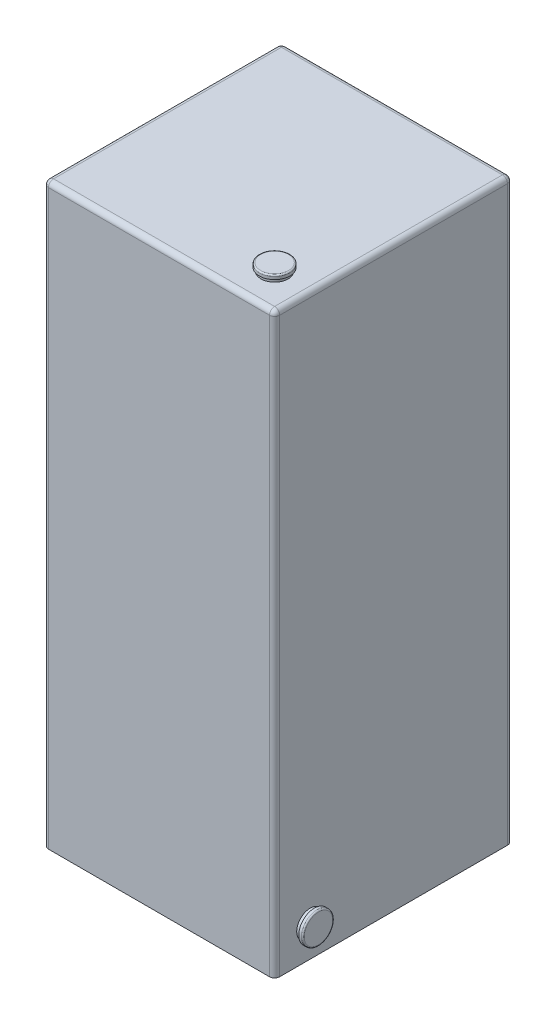
ISO-10303-21;
HEADER;
FILE_DESCRIPTION(('STEP AP214'),'2;1');
FILE_NAME('part.step','',(''),(''),'','','');
FILE_SCHEMA(('AUTOMOTIVE_DESIGN { 1 0 10303 214 1 1 1 1 }'));
ENDSEC;
DATA;
#1=APPLICATION_CONTEXT('core data for automotive mechanical design processes');
#2=APPLICATION_PROTOCOL_DEFINITION('international standard','automotive_design',2000,#1);
#3=PRODUCT_CONTEXT('',#1,'mechanical');
#4=PRODUCT('Part','Part','',(#3));
#5=PRODUCT_RELATED_PRODUCT_CATEGORY('part','',(#4));
#6=PRODUCT_DEFINITION_FORMATION('','',#4);
#7=PRODUCT_DEFINITION_CONTEXT('part definition',#1,'design');
#8=PRODUCT_DEFINITION('design','',#6,#7);
#9=PRODUCT_DEFINITION_SHAPE('','',#8);
#10=(LENGTH_UNIT() NAMED_UNIT(*) SI_UNIT(.MILLI.,.METRE.));
#11=(NAMED_UNIT(*) PLANE_ANGLE_UNIT() SI_UNIT($,.RADIAN.));
#12=(NAMED_UNIT(*) SI_UNIT($,.STERADIAN.) SOLID_ANGLE_UNIT());
#13=UNCERTAINTY_MEASURE_WITH_UNIT(LENGTH_MEASURE(1.E-05),#10,'distance_accuracy_value','');
#14=(GEOMETRIC_REPRESENTATION_CONTEXT(3) GLOBAL_UNCERTAINTY_ASSIGNED_CONTEXT((#13)) GLOBAL_UNIT_ASSIGNED_CONTEXT((#10,
#11,#12)) REPRESENTATION_CONTEXT('',''));
#15=CARTESIAN_POINT('',(0.,0.,0.));
#16=DIRECTION('',(0.,0.,1.));
#17=DIRECTION('',(1.,0.,0.));
#18=AXIS2_PLACEMENT_3D('',#15,#16,#17);
#19=CARTESIAN_POINT('',(704.,90.,595.));
#20=DIRECTION('',(-1.,0.,0.));
#21=DIRECTION('',(0.,0.,1.));
#22=AXIS2_PLACEMENT_3D('',#19,#20,#21);
#23=CYLINDRICAL_SURFACE('',#22,40.);
#24=CARTESIAN_POINT('',(680.,90.,595.));
#25=DIRECTION('',(-1.,0.,0.));
#26=DIRECTION('',(0.,0.,1.));
#27=AXIS2_PLACEMENT_3D('',#24,#25,#26);
#28=CIRCLE('',#27,40.);
#29=CARTESIAN_POINT('',(680.,90.,635.));
#30=VERTEX_POINT('',#29);
#31=EDGE_CURVE('E218',#30,#30,#28,.F.);
#32=ORIENTED_EDGE('',*,*,#31,.T.);
#33=EDGE_LOOP('',(#32));
#34=FACE_BOUND('',#33,.T.);
#35=CARTESIAN_POINT('',(692.,90.,595.));
#36=DIRECTION('',(1.,0.,0.));
#37=DIRECTION('',(0.,0.,-1.));
#38=AXIS2_PLACEMENT_3D('',#35,#36,#37);
#39=CIRCLE('',#38,40.);
#40=CARTESIAN_POINT('',(692.,90.,555.));
#41=VERTEX_POINT('',#40);
#42=EDGE_CURVE('E221',#41,#41,#39,.T.);
#43=ORIENTED_EDGE('',*,*,#42,.F.);
#44=EDGE_LOOP('',(#43));
#45=FACE_BOUND('',#44,.T.);
#46=ADVANCED_FACE('F36',(#34,#45),#23,.T.);
#47=CARTESIAN_POINT('',(575.,1722.,595.));
#48=DIRECTION('',(0.,-1.,0.));
#49=DIRECTION('',(0.,0.,-1.));
#50=AXIS2_PLACEMENT_3D('',#47,#48,#49);
#51=CYLINDRICAL_SURFACE('',#50,40.);
#52=CARTESIAN_POINT('',(575.,1700.,595.));
#53=DIRECTION('',(0.,-1.,0.));
#54=DIRECTION('',(0.,0.,-1.));
#55=AXIS2_PLACEMENT_3D('',#52,#53,#54);
#56=CIRCLE('',#55,40.);
#57=CARTESIAN_POINT('',(575.,1700.,555.));
#58=VERTEX_POINT('',#57);
#59=EDGE_CURVE('E171',#58,#58,#56,.F.);
#60=ORIENTED_EDGE('',*,*,#59,.T.);
#61=EDGE_LOOP('',(#60));
#62=FACE_BOUND('',#61,.T.);
#63=CARTESIAN_POINT('',(575.,1710.,595.));
#64=DIRECTION('',(0.,1.,0.));
#65=DIRECTION('',(0.,0.,1.));
#66=AXIS2_PLACEMENT_3D('',#63,#64,#65);
#67=CIRCLE('',#66,40.);
#68=CARTESIAN_POINT('',(575.,1710.,635.));
#69=VERTEX_POINT('',#68);
#70=EDGE_CURVE('E209',#69,#69,#67,.T.);
#71=ORIENTED_EDGE('',*,*,#70,.F.);
#72=EDGE_LOOP('',(#71));
#73=FACE_BOUND('',#72,.T.);
#74=ADVANCED_FACE('F237',(#62,#73),#51,.T.);
#75=CARTESIAN_POINT('',(0.,0.,700.));
#76=DIRECTION('',(1.,0.,0.));
#77=DIRECTION('',(0.,0.,-1.));
#78=AXIS2_PLACEMENT_3D('',#75,#76,#77);
#79=PLANE('',#78);
#80=DIRECTION('',(0.,0.,-1.));
#81=VECTOR('',#80,1.);
#82=CARTESIAN_POINT('',(0.,1685.,700.));
#83=LINE('',#82,#81);
#84=CARTESIAN_POINT('',(0.,1685.,685.));
#85=VERTEX_POINT('',#84);
#86=CARTESIAN_POINT('',(0.,1685.,15.));
#87=VERTEX_POINT('',#86);
#88=EDGE_CURVE('E131',#85,#87,#83,.T.);
#89=ORIENTED_EDGE('',*,*,#88,.T.);
#90=DIRECTION('',(0.,-1.,0.));
#91=VECTOR('',#90,1.);
#92=CARTESIAN_POINT('',(0.,0.,15.));
#93=LINE('',#92,#91);
#94=CARTESIAN_POINT('',(0.,0.,15.));
#95=VERTEX_POINT('',#94);
#96=EDGE_CURVE('E130',#87,#95,#93,.T.);
#97=ORIENTED_EDGE('',*,*,#96,.T.);
#98=DIRECTION('',(0.,0.,-1.));
#99=VECTOR('',#98,1.);
#100=CARTESIAN_POINT('',(0.,0.,700.));
#101=LINE('',#100,#99);
#102=CARTESIAN_POINT('',(0.,0.,685.));
#103=VERTEX_POINT('',#102);
#104=EDGE_CURVE('E117',#103,#95,#101,.T.);
#105=ORIENTED_EDGE('',*,*,#104,.F.);
#106=DIRECTION('',(0.,-1.,0.));
#107=VECTOR('',#106,1.);
#108=CARTESIAN_POINT('',(0.,0.,685.));
#109=LINE('',#108,#107);
#110=EDGE_CURVE('E127',#103,#85,#109,.F.);
#111=ORIENTED_EDGE('',*,*,#110,.T.);
#112=EDGE_LOOP('',(#89,#97,#105,#111));
#113=FACE_BOUND('',#112,.T.);
#114=ADVANCED_FACE('F126',(#113),#79,.F.);
#115=CARTESIAN_POINT('',(0.,0.,700.));
#116=DIRECTION('',(0.,1.,0.));
#117=DIRECTION('',(0.,0.,1.));
#118=AXIS2_PLACEMENT_3D('',#115,#116,#117);
#119=PLANE('',#118);
#120=ORIENTED_EDGE('',*,*,#104,.T.);
#121=CARTESIAN_POINT('',(15.,0.,15.));
#122=DIRECTION('',(0.,1.,0.));
#123=DIRECTION('',(0.,0.,1.));
#124=AXIS2_PLACEMENT_3D('',#121,#122,#123);
#125=CIRCLE('',#124,15.);
#126=CARTESIAN_POINT('',(15.,0.,0.));
#127=VERTEX_POINT('',#126);
#128=EDGE_CURVE('E144',#95,#127,#125,.F.);
#129=ORIENTED_EDGE('',*,*,#128,.T.);
#130=DIRECTION('',(1.,0.,0.));
#131=VECTOR('',#130,1.);
#132=CARTESIAN_POINT('',(0.,0.,0.));
#133=LINE('',#132,#131);
#134=CARTESIAN_POINT('',(665.,0.,0.));
#135=VERTEX_POINT('',#134);
#136=EDGE_CURVE('E206',#127,#135,#133,.T.);
#137=ORIENTED_EDGE('',*,*,#136,.T.);
#138=CARTESIAN_POINT('',(665.,0.,15.));
#139=DIRECTION('',(0.,1.,0.));
#140=DIRECTION('',(0.,0.,1.));
#141=AXIS2_PLACEMENT_3D('',#138,#139,#140);
#142=CIRCLE('',#141,15.);
#143=CARTESIAN_POINT('',(680.,0.,15.));
#144=VERTEX_POINT('',#143);
#145=EDGE_CURVE('E121',#135,#144,#142,.F.);
#146=ORIENTED_EDGE('',*,*,#145,.T.);
#147=DIRECTION('',(0.,0.,-1.));
#148=VECTOR('',#147,1.);
#149=CARTESIAN_POINT('',(680.,0.,700.));
#150=LINE('',#149,#148);
#151=CARTESIAN_POINT('',(680.,0.,685.));
#152=VERTEX_POINT('',#151);
#153=EDGE_CURVE('E132',#152,#144,#150,.T.);
#154=ORIENTED_EDGE('',*,*,#153,.F.);
#155=CARTESIAN_POINT('',(665.,0.,685.));
#156=DIRECTION('',(0.,1.,0.));
#157=DIRECTION('',(0.,0.,1.));
#158=AXIS2_PLACEMENT_3D('',#155,#156,#157);
#159=CIRCLE('',#158,15.);
#160=CARTESIAN_POINT('',(665.,0.,700.));
#161=VERTEX_POINT('',#160);
#162=EDGE_CURVE('E122',#152,#161,#159,.F.);
#163=ORIENTED_EDGE('',*,*,#162,.T.);
#164=DIRECTION('',(1.,0.,0.));
#165=VECTOR('',#164,1.);
#166=CARTESIAN_POINT('',(0.,0.,700.));
#167=LINE('',#166,#165);
#168=CARTESIAN_POINT('',(15.,0.,700.));
#169=VERTEX_POINT('',#168);
#170=EDGE_CURVE('E118',#169,#161,#167,.T.);
#171=ORIENTED_EDGE('',*,*,#170,.F.);
#172=CARTESIAN_POINT('',(15.,0.,685.));
#173=DIRECTION('',(0.,1.,0.));
#174=DIRECTION('',(0.,0.,1.));
#175=AXIS2_PLACEMENT_3D('',#172,#173,#174);
#176=CIRCLE('',#175,15.);
#177=EDGE_CURVE('E114',#169,#103,#176,.F.);
#178=ORIENTED_EDGE('',*,*,#177,.T.);
#179=EDGE_LOOP('',(#120,#129,#137,#146,#154,#163,#171,#178));
#180=FACE_BOUND('',#179,.T.);
#181=ADVANCED_FACE('F116',(#180),#119,.F.);
#182=CARTESIAN_POINT('',(680.,0.,700.));
#183=DIRECTION('',(-1.,0.,0.));
#184=DIRECTION('',(0.,0.,1.));
#185=AXIS2_PLACEMENT_3D('',#182,#183,#184);
#186=PLANE('',#185);
#187=ORIENTED_EDGE('',*,*,#31,.F.);
#188=EDGE_LOOP('',(#187));
#189=FACE_BOUND('',#188,.T.);
#190=ORIENTED_EDGE('',*,*,#153,.T.);
#191=DIRECTION('',(0.,1.,0.));
#192=VECTOR('',#191,1.);
#193=CARTESIAN_POINT('',(680.,1700.,15.));
#194=LINE('',#193,#192);
#195=CARTESIAN_POINT('',(680.,1685.,15.));
#196=VERTEX_POINT('',#195);
#197=EDGE_CURVE('E156',#144,#196,#194,.T.);
#198=ORIENTED_EDGE('',*,*,#197,.T.);
#199=DIRECTION('',(0.,0.,-1.));
#200=VECTOR('',#199,1.);
#201=CARTESIAN_POINT('',(680.,1685.,700.));
#202=LINE('',#201,#200);
#203=CARTESIAN_POINT('',(680.,1685.,685.));
#204=VERTEX_POINT('',#203);
#205=EDGE_CURVE('E152',#196,#204,#202,.F.);
#206=ORIENTED_EDGE('',*,*,#205,.T.);
#207=DIRECTION('',(0.,1.,0.));
#208=VECTOR('',#207,1.);
#209=CARTESIAN_POINT('',(680.,0.,685.));
#210=LINE('',#209,#208);
#211=EDGE_CURVE('E154',#204,#152,#210,.F.);
#212=ORIENTED_EDGE('',*,*,#211,.T.);
#213=EDGE_LOOP('',(#190,#198,#206,#212));
#214=FACE_BOUND('',#213,.T.);
#215=ADVANCED_FACE('F273',(#189,#214),#186,.F.);
#216=CARTESIAN_POINT('',(0.,1700.,700.));
#217=DIRECTION('',(0.,-1.,0.));
#218=DIRECTION('',(0.,0.,-1.));
#219=AXIS2_PLACEMENT_3D('',#216,#217,#218);
#220=PLANE('',#219);
#221=ORIENTED_EDGE('',*,*,#59,.F.);
#222=EDGE_LOOP('',(#221));
#223=FACE_BOUND('',#222,.T.);
#224=DIRECTION('',(0.,0.,-1.));
#225=VECTOR('',#224,1.);
#226=CARTESIAN_POINT('',(665.,1700.,700.));
#227=LINE('',#226,#225);
#228=CARTESIAN_POINT('',(665.,1700.,685.));
#229=VERTEX_POINT('',#228);
#230=CARTESIAN_POINT('',(665.,1700.,15.));
#231=VERTEX_POINT('',#230);
#232=EDGE_CURVE('E162',#229,#231,#227,.T.);
#233=ORIENTED_EDGE('',*,*,#232,.T.);
#234=DIRECTION('',(-1.,0.,0.));
#235=VECTOR('',#234,1.);
#236=CARTESIAN_POINT('',(0.,1700.,15.));
#237=LINE('',#236,#235);
#238=CARTESIAN_POINT('',(15.,1700.,15.));
#239=VERTEX_POINT('',#238);
#240=EDGE_CURVE('E164',#231,#239,#237,.T.);
#241=ORIENTED_EDGE('',*,*,#240,.T.);
#242=DIRECTION('',(0.,0.,-1.));
#243=VECTOR('',#242,1.);
#244=CARTESIAN_POINT('',(15.,1700.,700.));
#245=LINE('',#244,#243);
#246=CARTESIAN_POINT('',(15.,1700.,685.));
#247=VERTEX_POINT('',#246);
#248=EDGE_CURVE('E160',#239,#247,#245,.F.);
#249=ORIENTED_EDGE('',*,*,#248,.T.);
#250=DIRECTION('',(-1.,0.,0.));
#251=VECTOR('',#250,1.);
#252=CARTESIAN_POINT('',(0.,1700.,685.));
#253=LINE('',#252,#251);
#254=EDGE_CURVE('E158',#247,#229,#253,.F.);
#255=ORIENTED_EDGE('',*,*,#254,.T.);
#256=EDGE_LOOP('',(#233,#241,#249,#255));
#257=FACE_BOUND('',#256,.T.);
#258=ADVANCED_FACE('F266',(#223,#257),#220,.F.);
#259=CARTESIAN_POINT('',(0.,0.,700.));
#260=DIRECTION('',(0.,0.,-1.));
#261=DIRECTION('',(-1.,0.,0.));
#262=AXIS2_PLACEMENT_3D('',#259,#260,#261);
#263=PLANE('',#262);
#264=DIRECTION('',(-1.,0.,0.));
#265=VECTOR('',#264,1.);
#266=CARTESIAN_POINT('',(0.,1685.,700.));
#267=LINE('',#266,#265);
#268=CARTESIAN_POINT('',(665.,1685.,700.));
#269=VERTEX_POINT('',#268);
#270=CARTESIAN_POINT('',(15.,1685.,700.));
#271=VERTEX_POINT('',#270);
#272=EDGE_CURVE('E51',#269,#271,#267,.T.);
#273=ORIENTED_EDGE('',*,*,#272,.T.);
#274=DIRECTION('',(0.,-1.,0.));
#275=VECTOR('',#274,1.);
#276=CARTESIAN_POINT('',(15.,0.,700.));
#277=LINE('',#276,#275);
#278=EDGE_CURVE('E169',#271,#169,#277,.T.);
#279=ORIENTED_EDGE('',*,*,#278,.T.);
#280=ORIENTED_EDGE('',*,*,#170,.T.);
#281=DIRECTION('',(0.,1.,0.));
#282=VECTOR('',#281,1.);
#283=CARTESIAN_POINT('',(665.,0.,700.));
#284=LINE('',#283,#282);
#285=EDGE_CURVE('E56',#161,#269,#284,.T.);
#286=ORIENTED_EDGE('',*,*,#285,.T.);
#287=EDGE_LOOP('',(#273,#279,#280,#286));
#288=FACE_BOUND('',#287,.T.);
#289=ADVANCED_FACE('F262',(#288),#263,.F.);
#290=CARTESIAN_POINT('',(0.,0.,0.));
#291=DIRECTION('',(0.,0.,-1.));
#292=DIRECTION('',(-1.,0.,0.));
#293=AXIS2_PLACEMENT_3D('',#290,#291,#292);
#294=PLANE('',#293);
#295=ORIENTED_EDGE('',*,*,#136,.F.);
#296=DIRECTION('',(0.,-1.,0.));
#297=VECTOR('',#296,1.);
#298=CARTESIAN_POINT('',(15.,1700.,0.));
#299=LINE('',#298,#297);
#300=CARTESIAN_POINT('',(15.,1685.,0.));
#301=VERTEX_POINT('',#300);
#302=EDGE_CURVE('E150',#127,#301,#299,.F.);
#303=ORIENTED_EDGE('',*,*,#302,.T.);
#304=DIRECTION('',(-1.,0.,0.));
#305=VECTOR('',#304,1.);
#306=CARTESIAN_POINT('',(680.,1685.,0.));
#307=LINE('',#306,#305);
#308=CARTESIAN_POINT('',(665.,1685.,0.));
#309=VERTEX_POINT('',#308);
#310=EDGE_CURVE('E146',#301,#309,#307,.F.);
#311=ORIENTED_EDGE('',*,*,#310,.T.);
#312=DIRECTION('',(0.,1.,0.));
#313=VECTOR('',#312,1.);
#314=CARTESIAN_POINT('',(665.,0.,0.));
#315=LINE('',#314,#313);
#316=EDGE_CURVE('E148',#309,#135,#315,.F.);
#317=ORIENTED_EDGE('',*,*,#316,.T.);
#318=EDGE_LOOP('',(#295,#303,#311,#317));
#319=FACE_BOUND('',#318,.T.);
#320=ADVANCED_FACE('F265',(#319),#294,.T.);
#321=CARTESIAN_POINT('',(665.,0.,685.));
#322=DIRECTION('',(0.,1.,0.));
#323=DIRECTION('',(0.,0.,1.));
#324=AXIS2_PLACEMENT_3D('',#321,#322,#323);
#325=CYLINDRICAL_SURFACE('',#324,15.);
#326=CARTESIAN_POINT('',(665.,1685.,685.));
#327=DIRECTION('',(0.,1.,0.));
#328=DIRECTION('',(0.,0.,1.));
#329=AXIS2_PLACEMENT_3D('',#326,#327,#328);
#330=CIRCLE('',#329,15.);
#331=EDGE_CURVE('E203',#269,#204,#330,.T.);
#332=ORIENTED_EDGE('',*,*,#331,.F.);
#333=ORIENTED_EDGE('',*,*,#285,.F.);
#334=ORIENTED_EDGE('',*,*,#162,.F.);
#335=ORIENTED_EDGE('',*,*,#211,.F.);
#336=EDGE_LOOP('',(#332,#333,#334,#335));
#337=FACE_BOUND('',#336,.T.);
#338=ADVANCED_FACE('F269',(#337),#325,.T.);
#339=CARTESIAN_POINT('',(665.,1685.,685.));
#340=DIRECTION('',(0.,0.,1.));
#341=DIRECTION('',(1.,0.,0.));
#342=AXIS2_PLACEMENT_3D('',#339,#340,#341);
#343=SPHERICAL_SURFACE('',#342,15.);
#344=CARTESIAN_POINT('',(665.,1685.,685.));
#345=DIRECTION('',(1.,0.,0.));
#346=DIRECTION('',(0.,0.,-1.));
#347=AXIS2_PLACEMENT_3D('',#344,#345,#346);
#348=CIRCLE('',#347,15.);
#349=EDGE_CURVE('E197',#269,#229,#348,.F.);
#350=ORIENTED_EDGE('',*,*,#349,.F.);
#351=ORIENTED_EDGE('',*,*,#331,.T.);
#352=CARTESIAN_POINT('',(665.,1685.,685.));
#353=DIRECTION('',(0.,0.,1.));
#354=DIRECTION('',(1.,0.,0.));
#355=AXIS2_PLACEMENT_3D('',#352,#353,#354);
#356=CIRCLE('',#355,15.);
#357=EDGE_CURVE('E200',#229,#204,#356,.F.);
#358=ORIENTED_EDGE('',*,*,#357,.F.);
#359=EDGE_LOOP('',(#350,#351,#358));
#360=FACE_BOUND('',#359,.T.);
#361=ADVANCED_FACE('F318',(#360),#343,.T.);
#362=CARTESIAN_POINT('',(665.,0.,15.));
#363=DIRECTION('',(0.,-1.,0.));
#364=DIRECTION('',(0.,0.,-1.));
#365=AXIS2_PLACEMENT_3D('',#362,#363,#364);
#366=CYLINDRICAL_SURFACE('',#365,15.);
#367=ORIENTED_EDGE('',*,*,#145,.F.);
#368=ORIENTED_EDGE('',*,*,#316,.F.);
#369=CARTESIAN_POINT('',(665.,1685.,15.));
#370=DIRECTION('',(0.,1.,0.));
#371=DIRECTION('',(0.,0.,1.));
#372=AXIS2_PLACEMENT_3D('',#369,#370,#371);
#373=CIRCLE('',#372,15.);
#374=EDGE_CURVE('E194',#196,#309,#373,.T.);
#375=ORIENTED_EDGE('',*,*,#374,.F.);
#376=ORIENTED_EDGE('',*,*,#197,.F.);
#377=EDGE_LOOP('',(#367,#368,#375,#376));
#378=FACE_BOUND('',#377,.T.);
#379=ADVANCED_FACE('F314',(#378),#366,.T.);
#380=CARTESIAN_POINT('',(665.,1685.,700.));
#381=DIRECTION('',(0.,0.,-1.));
#382=DIRECTION('',(-1.,0.,0.));
#383=AXIS2_PLACEMENT_3D('',#380,#381,#382);
#384=CYLINDRICAL_SURFACE('',#383,15.);
#385=ORIENTED_EDGE('',*,*,#357,.T.);
#386=ORIENTED_EDGE('',*,*,#205,.F.);
#387=CARTESIAN_POINT('',(665.,1685.,15.));
#388=DIRECTION('',(0.,0.,-1.));
#389=DIRECTION('',(-1.,0.,0.));
#390=AXIS2_PLACEMENT_3D('',#387,#388,#389);
#391=CIRCLE('',#390,15.);
#392=EDGE_CURVE('E191',#231,#196,#391,.T.);
#393=ORIENTED_EDGE('',*,*,#392,.F.);
#394=ORIENTED_EDGE('',*,*,#232,.F.);
#395=EDGE_LOOP('',(#385,#386,#393,#394));
#396=FACE_BOUND('',#395,.T.);
#397=ADVANCED_FACE('F310',(#396),#384,.T.);
#398=CARTESIAN_POINT('',(0.,1685.,685.));
#399=DIRECTION('',(-1.,0.,0.));
#400=DIRECTION('',(0.,0.,1.));
#401=AXIS2_PLACEMENT_3D('',#398,#399,#400);
#402=CYLINDRICAL_SURFACE('',#401,15.);
#403=ORIENTED_EDGE('',*,*,#349,.T.);
#404=ORIENTED_EDGE('',*,*,#254,.F.);
#405=CARTESIAN_POINT('',(15.,1685.,685.));
#406=DIRECTION('',(-1.,0.,0.));
#407=DIRECTION('',(0.,0.,1.));
#408=AXIS2_PLACEMENT_3D('',#405,#406,#407);
#409=CIRCLE('',#408,15.);
#410=EDGE_CURVE('E188',#271,#247,#409,.T.);
#411=ORIENTED_EDGE('',*,*,#410,.F.);
#412=ORIENTED_EDGE('',*,*,#272,.F.);
#413=EDGE_LOOP('',(#403,#404,#411,#412));
#414=FACE_BOUND('',#413,.T.);
#415=ADVANCED_FACE('F307',(#414),#402,.T.);
#416=CARTESIAN_POINT('',(15.,0.,685.));
#417=DIRECTION('',(0.,-1.,0.));
#418=DIRECTION('',(0.,0.,-1.));
#419=AXIS2_PLACEMENT_3D('',#416,#417,#418);
#420=CYLINDRICAL_SURFACE('',#419,15.);
#421=ORIENTED_EDGE('',*,*,#177,.F.);
#422=ORIENTED_EDGE('',*,*,#278,.F.);
#423=CARTESIAN_POINT('',(15.,1685.,685.));
#424=DIRECTION('',(0.,1.,0.));
#425=DIRECTION('',(0.,0.,1.));
#426=AXIS2_PLACEMENT_3D('',#423,#424,#425);
#427=CIRCLE('',#426,15.);
#428=EDGE_CURVE('E136',#85,#271,#427,.T.);
#429=ORIENTED_EDGE('',*,*,#428,.F.);
#430=ORIENTED_EDGE('',*,*,#110,.F.);
#431=EDGE_LOOP('',(#421,#422,#429,#430));
#432=FACE_BOUND('',#431,.T.);
#433=ADVANCED_FACE('F134',(#432),#420,.T.);
#434=CARTESIAN_POINT('',(665.,1685.,15.));
#435=DIRECTION('',(0.,0.,1.));
#436=DIRECTION('',(1.,0.,0.));
#437=AXIS2_PLACEMENT_3D('',#434,#435,#436);
#438=SPHERICAL_SURFACE('',#437,15.);
#439=ORIENTED_EDGE('',*,*,#392,.T.);
#440=ORIENTED_EDGE('',*,*,#374,.T.);
#441=CARTESIAN_POINT('',(665.,1685.,15.));
#442=DIRECTION('',(1.,0.,0.));
#443=DIRECTION('',(0.,0.,-1.));
#444=AXIS2_PLACEMENT_3D('',#441,#442,#443);
#445=CIRCLE('',#444,15.);
#446=EDGE_CURVE('E184',#231,#309,#445,.F.);
#447=ORIENTED_EDGE('',*,*,#446,.F.);
#448=EDGE_LOOP('',(#439,#440,#447));
#449=FACE_BOUND('',#448,.T.);
#450=ADVANCED_FACE('F300',(#449),#438,.T.);
#451=CARTESIAN_POINT('',(15.,1685.,685.));
#452=DIRECTION('',(0.,0.,1.));
#453=DIRECTION('',(1.,0.,0.));
#454=AXIS2_PLACEMENT_3D('',#451,#452,#453);
#455=SPHERICAL_SURFACE('',#454,15.);
#456=ORIENTED_EDGE('',*,*,#428,.T.);
#457=ORIENTED_EDGE('',*,*,#410,.T.);
#458=CARTESIAN_POINT('',(15.,1685.,685.));
#459=DIRECTION('',(0.,0.,1.));
#460=DIRECTION('',(1.,0.,0.));
#461=AXIS2_PLACEMENT_3D('',#458,#459,#460);
#462=CIRCLE('',#461,15.);
#463=EDGE_CURVE('E181',#85,#247,#462,.F.);
#464=ORIENTED_EDGE('',*,*,#463,.F.);
#465=EDGE_LOOP('',(#456,#457,#464));
#466=FACE_BOUND('',#465,.T.);
#467=ADVANCED_FACE('F296',(#466),#455,.T.);
#468=CARTESIAN_POINT('',(0.,1685.,15.));
#469=DIRECTION('',(1.,0.,0.));
#470=DIRECTION('',(0.,0.,-1.));
#471=AXIS2_PLACEMENT_3D('',#468,#469,#470);
#472=CYLINDRICAL_SURFACE('',#471,15.);
#473=ORIENTED_EDGE('',*,*,#446,.T.);
#474=ORIENTED_EDGE('',*,*,#310,.F.);
#475=CARTESIAN_POINT('',(15.,1685.,15.));
#476=DIRECTION('',(-1.,0.,0.));
#477=DIRECTION('',(0.,0.,1.));
#478=AXIS2_PLACEMENT_3D('',#475,#476,#477);
#479=CIRCLE('',#478,15.);
#480=EDGE_CURVE('E178',#239,#301,#479,.T.);
#481=ORIENTED_EDGE('',*,*,#480,.F.);
#482=ORIENTED_EDGE('',*,*,#240,.F.);
#483=EDGE_LOOP('',(#473,#474,#481,#482));
#484=FACE_BOUND('',#483,.T.);
#485=ADVANCED_FACE('F292',(#484),#472,.T.);
#486=CARTESIAN_POINT('',(15.,1685.,700.));
#487=DIRECTION('',(0.,0.,-1.));
#488=DIRECTION('',(-1.,0.,0.));
#489=AXIS2_PLACEMENT_3D('',#486,#487,#488);
#490=CYLINDRICAL_SURFACE('',#489,15.);
#491=ORIENTED_EDGE('',*,*,#463,.T.);
#492=ORIENTED_EDGE('',*,*,#248,.F.);
#493=CARTESIAN_POINT('',(15.,1685.,15.));
#494=DIRECTION('',(0.,0.,-1.));
#495=DIRECTION('',(-1.,0.,0.));
#496=AXIS2_PLACEMENT_3D('',#493,#494,#495);
#497=CIRCLE('',#496,15.);
#498=EDGE_CURVE('E175',#87,#239,#497,.T.);
#499=ORIENTED_EDGE('',*,*,#498,.F.);
#500=ORIENTED_EDGE('',*,*,#88,.F.);
#501=EDGE_LOOP('',(#491,#492,#499,#500));
#502=FACE_BOUND('',#501,.T.);
#503=ADVANCED_FACE('F288',(#502),#490,.T.);
#504=CARTESIAN_POINT('',(15.,1685.,15.));
#505=DIRECTION('',(0.,0.,1.));
#506=DIRECTION('',(1.,0.,0.));
#507=AXIS2_PLACEMENT_3D('',#504,#505,#506);
#508=SPHERICAL_SURFACE('',#507,15.);
#509=ORIENTED_EDGE('',*,*,#498,.T.);
#510=ORIENTED_EDGE('',*,*,#480,.T.);
#511=CARTESIAN_POINT('',(15.,1685.,15.));
#512=DIRECTION('',(0.,1.,0.));
#513=DIRECTION('',(0.,0.,1.));
#514=AXIS2_PLACEMENT_3D('',#511,#512,#513);
#515=CIRCLE('',#514,15.);
#516=EDGE_CURVE('E172',#87,#301,#515,.F.);
#517=ORIENTED_EDGE('',*,*,#516,.F.);
#518=EDGE_LOOP('',(#509,#510,#517));
#519=FACE_BOUND('',#518,.T.);
#520=ADVANCED_FACE('F284',(#519),#508,.T.);
#521=CARTESIAN_POINT('',(15.,0.,15.));
#522=DIRECTION('',(0.,1.,0.));
#523=DIRECTION('',(0.,0.,1.));
#524=AXIS2_PLACEMENT_3D('',#521,#522,#523);
#525=CYLINDRICAL_SURFACE('',#524,15.);
#526=ORIENTED_EDGE('',*,*,#516,.T.);
#527=ORIENTED_EDGE('',*,*,#302,.F.);
#528=ORIENTED_EDGE('',*,*,#128,.F.);
#529=ORIENTED_EDGE('',*,*,#96,.F.);
#530=EDGE_LOOP('',(#526,#527,#528,#529));
#531=FACE_BOUND('',#530,.T.);
#532=ADVANCED_FACE('F256',(#531),#525,.T.);
#533=CARTESIAN_POINT('',(575.,1710.,595.));
#534=DIRECTION('',(0.,1.,0.));
#535=DIRECTION('',(0.,0.,1.));
#536=AXIS2_PLACEMENT_3D('',#533,#534,#535);
#537=CYLINDRICAL_SURFACE('',#536,45.0000000000001);
#538=CARTESIAN_POINT('',(575.,1718.,595.));
#539=DIRECTION('',(0.,1.,0.));
#540=DIRECTION('',(0.,0.,1.));
#541=AXIS2_PLACEMENT_3D('',#538,#539,#540);
#542=CIRCLE('',#541,45.0000000000001);
#543=CARTESIAN_POINT('',(575.,1718.,640.));
#544=VERTEX_POINT('',#543);
#545=EDGE_CURVE('E215',#544,#544,#542,.F.);
#546=ORIENTED_EDGE('',*,*,#545,.T.);
#547=EDGE_LOOP('',(#546));
#548=FACE_BOUND('',#547,.T.);
#549=CARTESIAN_POINT('',(575.,1710.,595.));
#550=DIRECTION('',(0.,1.,0.));
#551=DIRECTION('',(0.,0.,1.));
#552=AXIS2_PLACEMENT_3D('',#549,#550,#551);
#553=CIRCLE('',#552,45.0000000000001);
#554=CARTESIAN_POINT('',(575.,1710.,640.));
#555=VERTEX_POINT('',#554);
#556=EDGE_CURVE('E176',#555,#555,#553,.T.);
#557=ORIENTED_EDGE('',*,*,#556,.T.);
#558=EDGE_LOOP('',(#557));
#559=FACE_BOUND('',#558,.T.);
#560=ADVANCED_FACE('F252',(#548,#559),#537,.T.);
#561=CARTESIAN_POINT('',(575.,1710.,595.));
#562=DIRECTION('',(0.,1.,0.));
#563=DIRECTION('',(0.,0.,1.));
#564=AXIS2_PLACEMENT_3D('',#561,#562,#563);
#565=PLANE('',#564);
#566=ORIENTED_EDGE('',*,*,#70,.T.);
#567=EDGE_LOOP('',(#566));
#568=FACE_BOUND('',#567,.T.);
#569=ORIENTED_EDGE('',*,*,#556,.F.);
#570=EDGE_LOOP('',(#569));
#571=FACE_BOUND('',#570,.T.);
#572=ADVANCED_FACE('F248',(#568,#571),#565,.F.);
#573=CARTESIAN_POINT('',(575.,1722.,595.));
#574=DIRECTION('',(0.,1.,0.));
#575=DIRECTION('',(0.,0.,1.));
#576=AXIS2_PLACEMENT_3D('',#573,#574,#575);
#577=PLANE('',#576);
#578=CARTESIAN_POINT('',(575.,1722.,595.));
#579=DIRECTION('',(0.,1.,0.));
#580=DIRECTION('',(0.,0.,1.));
#581=AXIS2_PLACEMENT_3D('',#578,#579,#580);
#582=CIRCLE('',#581,41.0000000000001);
#583=CARTESIAN_POINT('',(575.,1722.,636.));
#584=VERTEX_POINT('',#583);
#585=EDGE_CURVE('E212',#584,#584,#582,.T.);
#586=ORIENTED_EDGE('',*,*,#585,.T.);
#587=EDGE_LOOP('',(#586));
#588=FACE_BOUND('',#587,.T.);
#589=ADVANCED_FACE('F251',(#588),#577,.T.);
#590=CARTESIAN_POINT('',(575.,1718.,595.));
#591=DIRECTION('',(0.,1.,0.));
#592=DIRECTION('',(0.,0.,1.));
#593=AXIS2_PLACEMENT_3D('',#590,#591,#592);
#594=TOROIDAL_SURFACE('',#593,41.0000000000001,4.);
#595=ORIENTED_EDGE('',*,*,#545,.F.);
#596=EDGE_LOOP('',(#595));
#597=FACE_BOUND('',#596,.T.);
#598=ORIENTED_EDGE('',*,*,#585,.F.);
#599=EDGE_LOOP('',(#598));
#600=FACE_BOUND('',#599,.T.);
#601=ADVANCED_FACE('F259',(#597,#600),#594,.T.);
#602=CARTESIAN_POINT('',(692.,90.,595.));
#603=DIRECTION('',(1.,0.,0.));
#604=DIRECTION('',(0.,0.,-1.));
#605=AXIS2_PLACEMENT_3D('',#602,#603,#604);
#606=CYLINDRICAL_SURFACE('',#605,46.);
#607=CARTESIAN_POINT('',(700.,90.,595.));
#608=DIRECTION('',(1.,0.,0.));
#609=DIRECTION('',(0.,0.,-1.));
#610=AXIS2_PLACEMENT_3D('',#607,#608,#609);
#611=CIRCLE('',#610,46.);
#612=CARTESIAN_POINT('',(700.,90.,549.));
#613=VERTEX_POINT('',#612);
#614=EDGE_CURVE('E11',#613,#613,#611,.F.);
#615=ORIENTED_EDGE('',*,*,#614,.T.);
#616=EDGE_LOOP('',(#615));
#617=FACE_BOUND('',#616,.T.);
#618=CARTESIAN_POINT('',(692.,90.,595.));
#619=DIRECTION('',(1.,0.,0.));
#620=DIRECTION('',(0.,0.,-1.));
#621=AXIS2_PLACEMENT_3D('',#618,#619,#620);
#622=CIRCLE('',#621,46.);
#623=CARTESIAN_POINT('',(692.,90.,549.));
#624=VERTEX_POINT('',#623);
#625=EDGE_CURVE('E339',#624,#624,#622,.T.);
#626=ORIENTED_EDGE('',*,*,#625,.T.);
#627=EDGE_LOOP('',(#626));
#628=FACE_BOUND('',#627,.T.);
#629=ADVANCED_FACE('F326',(#617,#628),#606,.T.);
#630=CARTESIAN_POINT('',(692.,90.,595.));
#631=DIRECTION('',(1.,0.,0.));
#632=DIRECTION('',(0.,0.,-1.));
#633=AXIS2_PLACEMENT_3D('',#630,#631,#632);
#634=PLANE('',#633);
#635=ORIENTED_EDGE('',*,*,#42,.T.);
#636=EDGE_LOOP('',(#635));
#637=FACE_BOUND('',#636,.T.);
#638=ORIENTED_EDGE('',*,*,#625,.F.);
#639=EDGE_LOOP('',(#638));
#640=FACE_BOUND('',#639,.T.);
#641=ADVANCED_FACE('F233',(#637,#640),#634,.F.);
#642=CARTESIAN_POINT('',(704.,90.,595.));
#643=DIRECTION('',(1.,0.,0.));
#644=DIRECTION('',(0.,0.,-1.));
#645=AXIS2_PLACEMENT_3D('',#642,#643,#644);
#646=PLANE('',#645);
#647=CARTESIAN_POINT('',(704.,90.,595.));
#648=DIRECTION('',(1.,0.,0.));
#649=DIRECTION('',(0.,0.,-1.));
#650=AXIS2_PLACEMENT_3D('',#647,#648,#649);
#651=CIRCLE('',#650,42.);
#652=CARTESIAN_POINT('',(704.,90.,553.));
#653=VERTEX_POINT('',#652);
#654=EDGE_CURVE('E44',#653,#653,#651,.T.);
#655=ORIENTED_EDGE('',*,*,#654,.T.);
#656=EDGE_LOOP('',(#655));
#657=FACE_BOUND('',#656,.T.);
#658=ADVANCED_FACE('F226',(#657),#646,.T.);
#659=CARTESIAN_POINT('',(700.,90.,595.));
#660=DIRECTION('',(1.,0.,0.));
#661=DIRECTION('',(0.,0.,-1.));
#662=AXIS2_PLACEMENT_3D('',#659,#660,#661);
#663=TOROIDAL_SURFACE('',#662,42.,4.);
#664=ORIENTED_EDGE('',*,*,#614,.F.);
#665=EDGE_LOOP('',(#664));
#666=FACE_BOUND('',#665,.T.);
#667=ORIENTED_EDGE('',*,*,#654,.F.);
#668=EDGE_LOOP('',(#667));
#669=FACE_BOUND('',#668,.T.);
#670=ADVANCED_FACE('F38',(#666,#669),#663,.T.);
#671=CLOSED_SHELL('',(#46,#74,#114,#181,#215,#258,#289,#320,#338,#361,#379,#397,#415,#433,#450,
#467,#485,#503,#520,#532,#560,#572,#589,#601,#629,#641,#658,#670));
#672=MANIFOLD_SOLID_BREP('B2',#671);
#673=ADVANCED_BREP_SHAPE_REPRESENTATION('',(#18,#672),#14);
#674=SHAPE_DEFINITION_REPRESENTATION(#9,#673);
ENDSEC;
END-ISO-10303-21;
